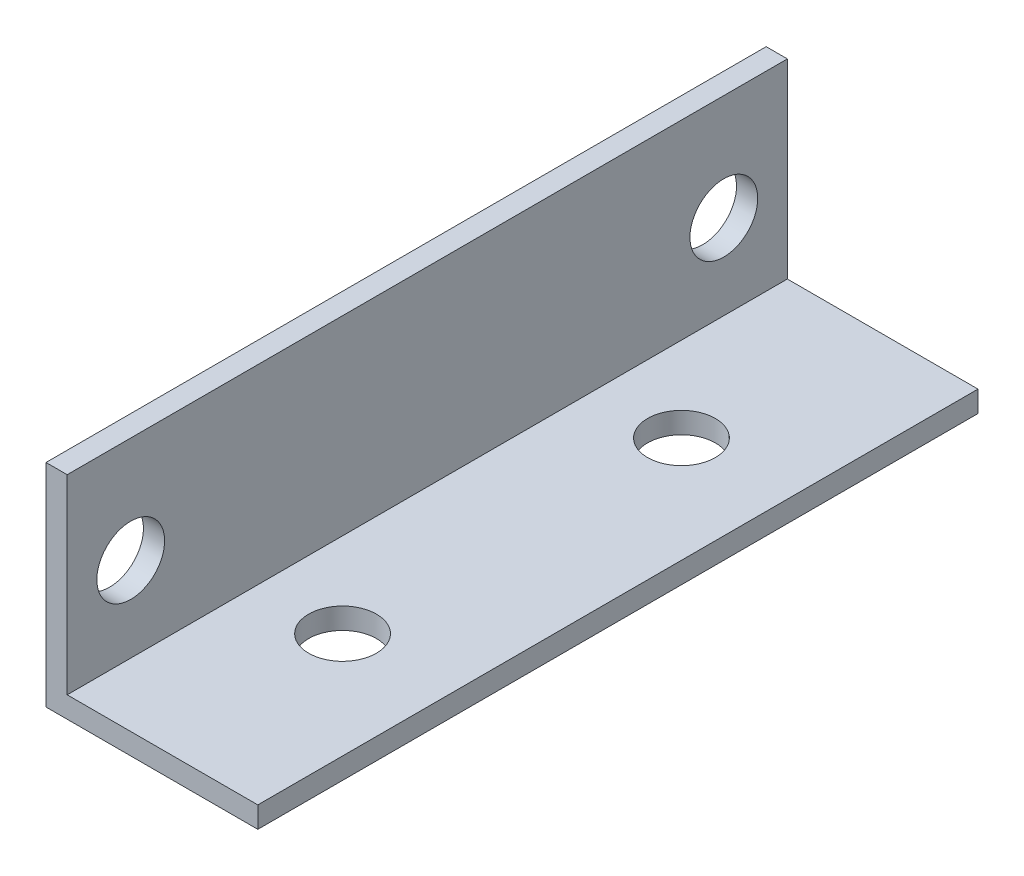
ISO-10303-21;
HEADER;
FILE_DESCRIPTION(('STEP AP214'),'2;1');
FILE_NAME('part.step','',(''),(''),'','','');
FILE_SCHEMA(('AUTOMOTIVE_DESIGN { 1 0 10303 214 1 1 1 1 }'));
ENDSEC;
DATA;
#1=APPLICATION_CONTEXT('core data for automotive mechanical design processes');
#2=APPLICATION_PROTOCOL_DEFINITION('international standard','automotive_design',2000,#1);
#3=PRODUCT_CONTEXT('',#1,'mechanical');
#4=PRODUCT('Part','Part','',(#3));
#5=PRODUCT_RELATED_PRODUCT_CATEGORY('part','',(#4));
#6=PRODUCT_DEFINITION_FORMATION('','',#4);
#7=PRODUCT_DEFINITION_CONTEXT('part definition',#1,'design');
#8=PRODUCT_DEFINITION('design','',#6,#7);
#9=PRODUCT_DEFINITION_SHAPE('','',#8);
#10=(LENGTH_UNIT() NAMED_UNIT(*) SI_UNIT(.MILLI.,.METRE.));
#11=(NAMED_UNIT(*) PLANE_ANGLE_UNIT() SI_UNIT($,.RADIAN.));
#12=(NAMED_UNIT(*) SI_UNIT($,.STERADIAN.) SOLID_ANGLE_UNIT());
#13=UNCERTAINTY_MEASURE_WITH_UNIT(LENGTH_MEASURE(1.E-05),#10,'distance_accuracy_value','');
#14=(GEOMETRIC_REPRESENTATION_CONTEXT(3) GLOBAL_UNCERTAINTY_ASSIGNED_CONTEXT((#13)) GLOBAL_UNIT_ASSIGNED_CONTEXT((#10,
#11,#12)) REPRESENTATION_CONTEXT('',''));
#15=CARTESIAN_POINT('',(0.,0.,0.));
#16=DIRECTION('',(0.,0.,1.));
#17=DIRECTION('',(1.,0.,0.));
#18=AXIS2_PLACEMENT_3D('',#15,#16,#17);
#19=CARTESIAN_POINT('',(-4.,-5.,17.));
#20=DIRECTION('',(-1.,0.,0.));
#21=DIRECTION('',(0.,-1.,0.));
#22=AXIS2_PLACEMENT_3D('',#19,#20,#21);
#23=PLANE('',#22);
#24=CARTESIAN_POINT('',(-4.,0.,-14.));
#25=DIRECTION('',(-1.,0.,0.));
#26=DIRECTION('',(0.,-1.,0.));
#27=AXIS2_PLACEMENT_3D('',#24,#25,#26);
#28=CIRCLE('',#27,1.60000000000001);
#29=CARTESIAN_POINT('',(-4.,-1.6,-14.));
#30=VERTEX_POINT('',#29);
#31=EDGE_CURVE('E120',#30,#30,#28,.T.);
#32=ORIENTED_EDGE('',*,*,#31,.T.);
#33=EDGE_LOOP('',(#32));
#34=FACE_BOUND('',#33,.T.);
#35=CARTESIAN_POINT('',(-4.,0.,14.));
#36=DIRECTION('',(-1.,0.,0.));
#37=DIRECTION('',(0.,-1.,0.));
#38=AXIS2_PLACEMENT_3D('',#35,#36,#37);
#39=CIRCLE('',#38,1.60000000000001);
#40=CARTESIAN_POINT('',(-4.,-1.6,14.));
#41=VERTEX_POINT('',#40);
#42=EDGE_CURVE('E151',#41,#41,#39,.T.);
#43=ORIENTED_EDGE('',*,*,#42,.T.);
#44=EDGE_LOOP('',(#43));
#45=FACE_BOUND('',#44,.T.);
#46=DIRECTION('',(0.,1.,0.));
#47=VECTOR('',#46,1.);
#48=CARTESIAN_POINT('',(-4.,-5.,-17.));
#49=LINE('',#48,#47);
#50=CARTESIAN_POINT('',(-4.,-4.,-17.));
#51=VERTEX_POINT('',#50);
#52=CARTESIAN_POINT('',(-4.,5.,-17.));
#53=VERTEX_POINT('',#52);
#54=EDGE_CURVE('E116',#51,#53,#49,.T.);
#55=ORIENTED_EDGE('',*,*,#54,.T.);
#56=DIRECTION('',(0.,0.,-1.));
#57=VECTOR('',#56,1.);
#58=CARTESIAN_POINT('',(-4.,5.,17.));
#59=LINE('',#58,#57);
#60=CARTESIAN_POINT('',(-4.,5.,17.));
#61=VERTEX_POINT('',#60);
#62=EDGE_CURVE('E11',#61,#53,#59,.T.);
#63=ORIENTED_EDGE('',*,*,#62,.F.);
#64=DIRECTION('',(0.,1.,0.));
#65=VECTOR('',#64,1.);
#66=CARTESIAN_POINT('',(-4.,-5.,17.));
#67=LINE('',#66,#65);
#68=CARTESIAN_POINT('',(-4.,-4.,17.));
#69=VERTEX_POINT('',#68);
#70=EDGE_CURVE('E81',#69,#61,#67,.T.);
#71=ORIENTED_EDGE('',*,*,#70,.F.);
#72=DIRECTION('',(0.,0.,-1.));
#73=VECTOR('',#72,1.);
#74=CARTESIAN_POINT('',(-4.,-4.,17.));
#75=LINE('',#74,#73);
#76=EDGE_CURVE('E112',#69,#51,#75,.T.);
#77=ORIENTED_EDGE('',*,*,#76,.T.);
#78=EDGE_LOOP('',(#55,#63,#71,#77));
#79=FACE_BOUND('',#78,.T.);
#80=ADVANCED_FACE('F33',(#34,#45,#79),#23,.F.);
#81=CARTESIAN_POINT('',(-5.,5.,17.));
#82=DIRECTION('',(0.,1.,0.));
#83=DIRECTION('',(0.,0.,1.));
#84=AXIS2_PLACEMENT_3D('',#81,#82,#83);
#85=PLANE('',#84);
#86=DIRECTION('',(1.,0.,0.));
#87=VECTOR('',#86,1.);
#88=CARTESIAN_POINT('',(-5.,5.,-17.));
#89=LINE('',#88,#87);
#90=CARTESIAN_POINT('',(-5.,5.,-17.));
#91=VERTEX_POINT('',#90);
#92=EDGE_CURVE('E119',#91,#53,#89,.T.);
#93=ORIENTED_EDGE('',*,*,#92,.F.);
#94=DIRECTION('',(0.,0.,-1.));
#95=VECTOR('',#94,1.);
#96=CARTESIAN_POINT('',(-5.,5.,17.));
#97=LINE('',#96,#95);
#98=CARTESIAN_POINT('',(-5.,5.,17.));
#99=VERTEX_POINT('',#98);
#100=EDGE_CURVE('E42',#99,#91,#97,.T.);
#101=ORIENTED_EDGE('',*,*,#100,.F.);
#102=DIRECTION('',(1.,0.,0.));
#103=VECTOR('',#102,1.);
#104=CARTESIAN_POINT('',(-5.,5.,17.));
#105=LINE('',#104,#103);
#106=EDGE_CURVE('E159',#99,#61,#105,.T.);
#107=ORIENTED_EDGE('',*,*,#106,.T.);
#108=ORIENTED_EDGE('',*,*,#62,.T.);
#109=EDGE_LOOP('',(#93,#101,#107,#108));
#110=FACE_BOUND('',#109,.T.);
#111=ADVANCED_FACE('F181',(#110),#85,.T.);
#112=CARTESIAN_POINT('',(-5.,-5.,17.));
#113=DIRECTION('',(-1.,0.,0.));
#114=DIRECTION('',(0.,-1.,0.));
#115=AXIS2_PLACEMENT_3D('',#112,#113,#114);
#116=PLANE('',#115);
#117=CARTESIAN_POINT('',(-5.,0.,-14.));
#118=DIRECTION('',(-1.,0.,0.));
#119=DIRECTION('',(0.,-1.,0.));
#120=AXIS2_PLACEMENT_3D('',#117,#118,#119);
#121=CIRCLE('',#120,1.60000000000001);
#122=CARTESIAN_POINT('',(-5.,-1.6,-14.));
#123=VERTEX_POINT('',#122);
#124=EDGE_CURVE('E148',#123,#123,#121,.T.);
#125=ORIENTED_EDGE('',*,*,#124,.F.);
#126=EDGE_LOOP('',(#125));
#127=FACE_BOUND('',#126,.T.);
#128=CARTESIAN_POINT('',(-5.,0.,14.));
#129=DIRECTION('',(-1.,0.,0.));
#130=DIRECTION('',(0.,1.,0.));
#131=AXIS2_PLACEMENT_3D('',#128,#129,#130);
#132=CIRCLE('',#131,1.60000000000001);
#133=CARTESIAN_POINT('',(-5.,1.60000000000001,14.));
#134=VERTEX_POINT('',#133);
#135=EDGE_CURVE('E139',#134,#134,#132,.T.);
#136=ORIENTED_EDGE('',*,*,#135,.F.);
#137=EDGE_LOOP('',(#136));
#138=FACE_BOUND('',#137,.T.);
#139=DIRECTION('',(0.,1.,0.));
#140=VECTOR('',#139,1.);
#141=CARTESIAN_POINT('',(-5.,-5.,-17.));
#142=LINE('',#141,#140);
#143=CARTESIAN_POINT('',(-5.,-5.,-17.));
#144=VERTEX_POINT('',#143);
#145=EDGE_CURVE('E123',#144,#91,#142,.T.);
#146=ORIENTED_EDGE('',*,*,#145,.F.);
#147=DIRECTION('',(0.,0.,-1.));
#148=VECTOR('',#147,1.);
#149=CARTESIAN_POINT('',(-5.,-5.,17.));
#150=LINE('',#149,#148);
#151=CARTESIAN_POINT('',(-5.,-5.,17.));
#152=VERTEX_POINT('',#151);
#153=EDGE_CURVE('E102',#152,#144,#150,.T.);
#154=ORIENTED_EDGE('',*,*,#153,.F.);
#155=DIRECTION('',(0.,1.,0.));
#156=VECTOR('',#155,1.);
#157=CARTESIAN_POINT('',(-5.,-5.,17.));
#158=LINE('',#157,#156);
#159=EDGE_CURVE('E108',#152,#99,#158,.T.);
#160=ORIENTED_EDGE('',*,*,#159,.T.);
#161=ORIENTED_EDGE('',*,*,#100,.T.);
#162=EDGE_LOOP('',(#146,#154,#160,#161));
#163=FACE_BOUND('',#162,.T.);
#164=ADVANCED_FACE('F163',(#127,#138,#163),#116,.T.);
#165=CARTESIAN_POINT('',(5.,-5.,17.));
#166=DIRECTION('',(0.,-1.,0.));
#167=DIRECTION('',(1.,0.,0.));
#168=AXIS2_PLACEMENT_3D('',#165,#166,#167);
#169=PLANE('',#168);
#170=CARTESIAN_POINT('',(0.,-5.,-8.));
#171=DIRECTION('',(0.,-1.,0.));
#172=DIRECTION('',(1.,0.,0.));
#173=AXIS2_PLACEMENT_3D('',#170,#171,#172);
#174=CIRCLE('',#173,1.6);
#175=CARTESIAN_POINT('',(1.6,-5.,-8.));
#176=VERTEX_POINT('',#175);
#177=EDGE_CURVE('E135',#176,#176,#174,.T.);
#178=ORIENTED_EDGE('',*,*,#177,.F.);
#179=EDGE_LOOP('',(#178));
#180=FACE_BOUND('',#179,.T.);
#181=CARTESIAN_POINT('',(0.,-5.,8.));
#182=DIRECTION('',(0.,-1.,0.));
#183=DIRECTION('',(-1.,0.,0.));
#184=AXIS2_PLACEMENT_3D('',#181,#182,#183);
#185=CIRCLE('',#184,1.6);
#186=CARTESIAN_POINT('',(-1.6,-5.,8.));
#187=VERTEX_POINT('',#186);
#188=EDGE_CURVE('E141',#187,#187,#185,.T.);
#189=ORIENTED_EDGE('',*,*,#188,.F.);
#190=EDGE_LOOP('',(#189));
#191=FACE_BOUND('',#190,.T.);
#192=DIRECTION('',(-1.,0.,0.));
#193=VECTOR('',#192,1.);
#194=CARTESIAN_POINT('',(5.,-5.,-17.));
#195=LINE('',#194,#193);
#196=CARTESIAN_POINT('',(5.,-5.,-17.));
#197=VERTEX_POINT('',#196);
#198=EDGE_CURVE('E97',#197,#144,#195,.T.);
#199=ORIENTED_EDGE('',*,*,#198,.F.);
#200=DIRECTION('',(0.,0.,-1.));
#201=VECTOR('',#200,1.);
#202=CARTESIAN_POINT('',(5.,-5.,17.));
#203=LINE('',#202,#201);
#204=CARTESIAN_POINT('',(5.,-5.,17.));
#205=VERTEX_POINT('',#204);
#206=EDGE_CURVE('E92',#205,#197,#203,.T.);
#207=ORIENTED_EDGE('',*,*,#206,.F.);
#208=DIRECTION('',(-1.,0.,0.));
#209=VECTOR('',#208,1.);
#210=CARTESIAN_POINT('',(5.,-5.,17.));
#211=LINE('',#210,#209);
#212=EDGE_CURVE('E95',#205,#152,#211,.T.);
#213=ORIENTED_EDGE('',*,*,#212,.T.);
#214=ORIENTED_EDGE('',*,*,#153,.T.);
#215=EDGE_LOOP('',(#199,#207,#213,#214));
#216=FACE_BOUND('',#215,.T.);
#217=ADVANCED_FACE('F94',(#180,#191,#216),#169,.T.);
#218=CARTESIAN_POINT('',(5.,-4.,17.));
#219=DIRECTION('',(1.,0.,0.));
#220=DIRECTION('',(0.,0.,-1.));
#221=AXIS2_PLACEMENT_3D('',#218,#219,#220);
#222=PLANE('',#221);
#223=DIRECTION('',(0.,-1.,0.));
#224=VECTOR('',#223,1.);
#225=CARTESIAN_POINT('',(5.,-4.,-17.));
#226=LINE('',#225,#224);
#227=CARTESIAN_POINT('',(5.,-4.,-17.));
#228=VERTEX_POINT('',#227);
#229=EDGE_CURVE('E127',#228,#197,#226,.T.);
#230=ORIENTED_EDGE('',*,*,#229,.F.);
#231=DIRECTION('',(0.,0.,-1.));
#232=VECTOR('',#231,1.);
#233=CARTESIAN_POINT('',(5.,-4.,17.));
#234=LINE('',#233,#232);
#235=CARTESIAN_POINT('',(5.,-4.,17.));
#236=VERTEX_POINT('',#235);
#237=EDGE_CURVE('E72',#236,#228,#234,.T.);
#238=ORIENTED_EDGE('',*,*,#237,.F.);
#239=DIRECTION('',(0.,-1.,0.));
#240=VECTOR('',#239,1.);
#241=CARTESIAN_POINT('',(5.,-4.,17.));
#242=LINE('',#241,#240);
#243=EDGE_CURVE('E106',#236,#205,#242,.T.);
#244=ORIENTED_EDGE('',*,*,#243,.T.);
#245=ORIENTED_EDGE('',*,*,#206,.T.);
#246=EDGE_LOOP('',(#230,#238,#244,#245));
#247=FACE_BOUND('',#246,.T.);
#248=ADVANCED_FACE('F110',(#247),#222,.T.);
#249=CARTESIAN_POINT('',(5.,-4.,17.));
#250=DIRECTION('',(0.,-1.,0.));
#251=DIRECTION('',(1.,0.,0.));
#252=AXIS2_PLACEMENT_3D('',#249,#250,#251);
#253=PLANE('',#252);
#254=CARTESIAN_POINT('',(0.,-4.,-8.));
#255=DIRECTION('',(0.,-1.,0.));
#256=DIRECTION('',(1.,0.,0.));
#257=AXIS2_PLACEMENT_3D('',#254,#255,#256);
#258=CIRCLE('',#257,1.6);
#259=CARTESIAN_POINT('',(1.6,-4.,-8.));
#260=VERTEX_POINT('',#259);
#261=EDGE_CURVE('E36',#260,#260,#258,.T.);
#262=ORIENTED_EDGE('',*,*,#261,.T.);
#263=EDGE_LOOP('',(#262));
#264=FACE_BOUND('',#263,.T.);
#265=CARTESIAN_POINT('',(0.,-4.,8.));
#266=DIRECTION('',(0.,-1.,0.));
#267=DIRECTION('',(1.,0.,0.));
#268=AXIS2_PLACEMENT_3D('',#265,#266,#267);
#269=CIRCLE('',#268,1.6);
#270=CARTESIAN_POINT('',(1.6,-4.,8.));
#271=VERTEX_POINT('',#270);
#272=EDGE_CURVE('E133',#271,#271,#269,.T.);
#273=ORIENTED_EDGE('',*,*,#272,.T.);
#274=EDGE_LOOP('',(#273));
#275=FACE_BOUND('',#274,.T.);
#276=DIRECTION('',(-1.,0.,0.));
#277=VECTOR('',#276,1.);
#278=CARTESIAN_POINT('',(5.,-4.,-17.));
#279=LINE('',#278,#277);
#280=EDGE_CURVE('E75',#228,#51,#279,.T.);
#281=ORIENTED_EDGE('',*,*,#280,.T.);
#282=ORIENTED_EDGE('',*,*,#76,.F.);
#283=DIRECTION('',(-1.,0.,0.));
#284=VECTOR('',#283,1.);
#285=CARTESIAN_POINT('',(5.,-4.,17.));
#286=LINE('',#285,#284);
#287=EDGE_CURVE('E51',#236,#69,#286,.T.);
#288=ORIENTED_EDGE('',*,*,#287,.F.);
#289=ORIENTED_EDGE('',*,*,#237,.T.);
#290=EDGE_LOOP('',(#281,#282,#288,#289));
#291=FACE_BOUND('',#290,.T.);
#292=ADVANCED_FACE('F169',(#264,#275,#291),#253,.F.);
#293=CARTESIAN_POINT('',(0.,0.,17.));
#294=DIRECTION('',(0.,0.,-1.));
#295=DIRECTION('',(-1.,0.,0.));
#296=AXIS2_PLACEMENT_3D('',#293,#294,#295);
#297=PLANE('',#296);
#298=ORIENTED_EDGE('',*,*,#70,.T.);
#299=ORIENTED_EDGE('',*,*,#106,.F.);
#300=ORIENTED_EDGE('',*,*,#159,.F.);
#301=ORIENTED_EDGE('',*,*,#212,.F.);
#302=ORIENTED_EDGE('',*,*,#243,.F.);
#303=ORIENTED_EDGE('',*,*,#287,.T.);
#304=EDGE_LOOP('',(#298,#299,#300,#301,#302,#303));
#305=FACE_BOUND('',#304,.T.);
#306=ADVANCED_FACE('F105',(#305),#297,.F.);
#307=CARTESIAN_POINT('',(0.,0.,-17.));
#308=DIRECTION('',(0.,0.,-1.));
#309=DIRECTION('',(-1.,0.,0.));
#310=AXIS2_PLACEMENT_3D('',#307,#308,#309);
#311=PLANE('',#310);
#312=ORIENTED_EDGE('',*,*,#54,.F.);
#313=ORIENTED_EDGE('',*,*,#280,.F.);
#314=ORIENTED_EDGE('',*,*,#229,.T.);
#315=ORIENTED_EDGE('',*,*,#198,.T.);
#316=ORIENTED_EDGE('',*,*,#145,.T.);
#317=ORIENTED_EDGE('',*,*,#92,.T.);
#318=EDGE_LOOP('',(#312,#313,#314,#315,#316,#317));
#319=FACE_BOUND('',#318,.T.);
#320=ADVANCED_FACE('F167',(#319),#311,.T.);
#321=CARTESIAN_POINT('',(5.,0.,14.));
#322=DIRECTION('',(-1.,0.,0.));
#323=DIRECTION('',(0.,-1.,0.));
#324=AXIS2_PLACEMENT_3D('',#321,#322,#323);
#325=CYLINDRICAL_SURFACE('',#324,1.60000000000001);
#326=ORIENTED_EDGE('',*,*,#135,.T.);
#327=EDGE_LOOP('',(#326));
#328=FACE_BOUND('',#327,.T.);
#329=ORIENTED_EDGE('',*,*,#42,.F.);
#330=EDGE_LOOP('',(#329));
#331=FACE_BOUND('',#330,.T.);
#332=ADVANCED_FACE('F191',(#328,#331),#325,.F.);
#333=CARTESIAN_POINT('',(5.,0.,-14.));
#334=DIRECTION('',(-1.,0.,0.));
#335=DIRECTION('',(0.,-1.,0.));
#336=AXIS2_PLACEMENT_3D('',#333,#334,#335);
#337=CYLINDRICAL_SURFACE('',#336,1.60000000000001);
#338=ORIENTED_EDGE('',*,*,#124,.T.);
#339=EDGE_LOOP('',(#338));
#340=FACE_BOUND('',#339,.T.);
#341=ORIENTED_EDGE('',*,*,#31,.F.);
#342=EDGE_LOOP('',(#341));
#343=FACE_BOUND('',#342,.T.);
#344=ADVANCED_FACE('F193',(#340,#343),#337,.F.);
#345=CARTESIAN_POINT('',(0.,5.,8.));
#346=DIRECTION('',(0.,-1.,0.));
#347=DIRECTION('',(1.,0.,0.));
#348=AXIS2_PLACEMENT_3D('',#345,#346,#347);
#349=CYLINDRICAL_SURFACE('',#348,1.6);
#350=ORIENTED_EDGE('',*,*,#188,.T.);
#351=EDGE_LOOP('',(#350));
#352=FACE_BOUND('',#351,.T.);
#353=ORIENTED_EDGE('',*,*,#272,.F.);
#354=EDGE_LOOP('',(#353));
#355=FACE_BOUND('',#354,.T.);
#356=ADVANCED_FACE('F200',(#352,#355),#349,.F.);
#357=CARTESIAN_POINT('',(0.,5.,-8.));
#358=DIRECTION('',(0.,-1.,0.));
#359=DIRECTION('',(1.,0.,0.));
#360=AXIS2_PLACEMENT_3D('',#357,#358,#359);
#361=CYLINDRICAL_SURFACE('',#360,1.6);
#362=ORIENTED_EDGE('',*,*,#177,.T.);
#363=EDGE_LOOP('',(#362));
#364=FACE_BOUND('',#363,.T.);
#365=ORIENTED_EDGE('',*,*,#261,.F.);
#366=EDGE_LOOP('',(#365));
#367=FACE_BOUND('',#366,.T.);
#368=ADVANCED_FACE('F206',(#364,#367),#361,.F.);
#369=CLOSED_SHELL('',(#80,#111,#164,#217,#248,#292,#306,#320,#332,#344,#356,#368));
#370=MANIFOLD_SOLID_BREP('B2',#369);
#371=ADVANCED_BREP_SHAPE_REPRESENTATION('',(#18,#370),#14);
#372=SHAPE_DEFINITION_REPRESENTATION(#9,#371);
ENDSEC;
END-ISO-10303-21;
